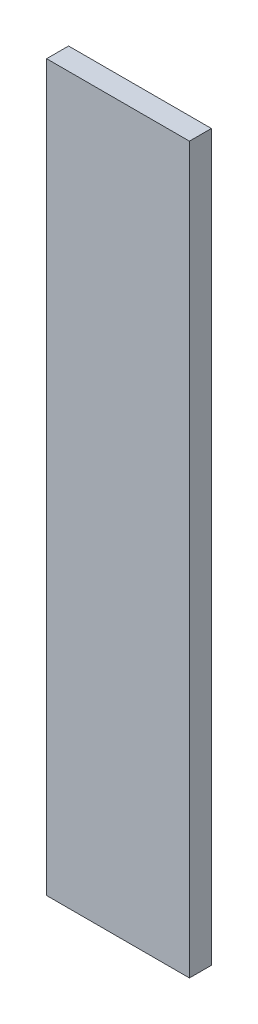
ISO-10303-21;
HEADER;
FILE_DESCRIPTION(('STEP AP214'),'2;1');
FILE_NAME('part.step','',(''),(''),'','','');
FILE_SCHEMA(('AUTOMOTIVE_DESIGN { 1 0 10303 214 1 1 1 1 }'));
ENDSEC;
DATA;
#1=APPLICATION_CONTEXT('core data for automotive mechanical design processes');
#2=APPLICATION_PROTOCOL_DEFINITION('international standard','automotive_design',2000,#1);
#3=PRODUCT_CONTEXT('',#1,'mechanical');
#4=PRODUCT('Part','Part','',(#3));
#5=PRODUCT_RELATED_PRODUCT_CATEGORY('part','',(#4));
#6=PRODUCT_DEFINITION_FORMATION('','',#4);
#7=PRODUCT_DEFINITION_CONTEXT('part definition',#1,'design');
#8=PRODUCT_DEFINITION('design','',#6,#7);
#9=PRODUCT_DEFINITION_SHAPE('','',#8);
#10=(LENGTH_UNIT() NAMED_UNIT(*) SI_UNIT(.MILLI.,.METRE.));
#11=(NAMED_UNIT(*) PLANE_ANGLE_UNIT() SI_UNIT($,.RADIAN.));
#12=(NAMED_UNIT(*) SI_UNIT($,.STERADIAN.) SOLID_ANGLE_UNIT());
#13=UNCERTAINTY_MEASURE_WITH_UNIT(LENGTH_MEASURE(1.E-05),#10,'distance_accuracy_value','');
#14=(GEOMETRIC_REPRESENTATION_CONTEXT(3) GLOBAL_UNCERTAINTY_ASSIGNED_CONTEXT((#13)) GLOBAL_UNIT_ASSIGNED_CONTEXT((#10,
#11,#12)) REPRESENTATION_CONTEXT('',''));
#15=CARTESIAN_POINT('',(0.,0.,0.));
#16=DIRECTION('',(0.,0.,1.));
#17=DIRECTION('',(1.,0.,0.));
#18=AXIS2_PLACEMENT_3D('',#15,#16,#17);
#19=CARTESIAN_POINT('',(-5.85,29.685,1.8));
#20=DIRECTION('',(1.,0.,0.));
#21=DIRECTION('',(0.,1.,0.));
#22=AXIS2_PLACEMENT_3D('',#19,#20,#21);
#23=PLANE('',#22);
#24=DIRECTION('',(0.,-1.,0.));
#25=VECTOR('',#24,1.);
#26=CARTESIAN_POINT('',(-5.85,29.685,0.));
#27=LINE('',#26,#25);
#28=CARTESIAN_POINT('',(-5.85,29.685,0.));
#29=VERTEX_POINT('',#28);
#30=CARTESIAN_POINT('',(-5.85,-29.685,0.));
#31=VERTEX_POINT('',#30);
#32=EDGE_CURVE('E101',#29,#31,#27,.T.);
#33=ORIENTED_EDGE('',*,*,#32,.T.);
#34=DIRECTION('',(0.,0.,-1.));
#35=VECTOR('',#34,1.);
#36=CARTESIAN_POINT('',(-5.85,-29.685,1.8));
#37=LINE('',#36,#35);
#38=CARTESIAN_POINT('',(-5.85,-29.685,1.8));
#39=VERTEX_POINT('',#38);
#40=EDGE_CURVE('E11',#39,#31,#37,.T.);
#41=ORIENTED_EDGE('',*,*,#40,.F.);
#42=DIRECTION('',(0.,-1.,0.));
#43=VECTOR('',#42,1.);
#44=CARTESIAN_POINT('',(-5.85,29.685,1.8));
#45=LINE('',#44,#43);
#46=CARTESIAN_POINT('',(-5.85,29.685,1.8));
#47=VERTEX_POINT('',#46);
#48=EDGE_CURVE('E89',#47,#39,#45,.T.);
#49=ORIENTED_EDGE('',*,*,#48,.F.);
#50=DIRECTION('',(0.,0.,-1.));
#51=VECTOR('',#50,1.);
#52=CARTESIAN_POINT('',(-5.85,29.685,1.8));
#53=LINE('',#52,#51);
#54=EDGE_CURVE('E97',#47,#29,#53,.T.);
#55=ORIENTED_EDGE('',*,*,#54,.T.);
#56=EDGE_LOOP('',(#33,#41,#49,#55));
#57=FACE_BOUND('',#56,.T.);
#58=ADVANCED_FACE('F38',(#57),#23,.F.);
#59=CARTESIAN_POINT('',(5.85,-29.685,1.8));
#60=DIRECTION('',(0.,1.,0.));
#61=DIRECTION('',(0.,0.,1.));
#62=AXIS2_PLACEMENT_3D('',#59,#60,#61);
#63=PLANE('',#62);
#64=DIRECTION('',(1.,0.,0.));
#65=VECTOR('',#64,1.);
#66=CARTESIAN_POINT('',(5.85,-29.685,0.));
#67=LINE('',#66,#65);
#68=CARTESIAN_POINT('',(5.85,-29.685,0.));
#69=VERTEX_POINT('',#68);
#70=EDGE_CURVE('E93',#31,#69,#67,.T.);
#71=ORIENTED_EDGE('',*,*,#70,.T.);
#72=DIRECTION('',(0.,0.,-1.));
#73=VECTOR('',#72,1.);
#74=CARTESIAN_POINT('',(5.85,-29.685,1.8));
#75=LINE('',#74,#73);
#76=CARTESIAN_POINT('',(5.85,-29.685,1.8));
#77=VERTEX_POINT('',#76);
#78=EDGE_CURVE('E46',#77,#69,#75,.T.);
#79=ORIENTED_EDGE('',*,*,#78,.F.);
#80=DIRECTION('',(1.,0.,0.));
#81=VECTOR('',#80,1.);
#82=CARTESIAN_POINT('',(5.85,-29.685,1.8));
#83=LINE('',#82,#81);
#84=EDGE_CURVE('E84',#39,#77,#83,.T.);
#85=ORIENTED_EDGE('',*,*,#84,.F.);
#86=ORIENTED_EDGE('',*,*,#40,.T.);
#87=EDGE_LOOP('',(#71,#79,#85,#86));
#88=FACE_BOUND('',#87,.T.);
#89=ADVANCED_FACE('F92',(#88),#63,.F.);
#90=CARTESIAN_POINT('',(5.85,29.685,1.8));
#91=DIRECTION('',(-1.,0.,0.));
#92=DIRECTION('',(0.,-1.,0.));
#93=AXIS2_PLACEMENT_3D('',#90,#91,#92);
#94=PLANE('',#93);
#95=DIRECTION('',(0.,1.,0.));
#96=VECTOR('',#95,1.);
#97=CARTESIAN_POINT('',(5.85,29.685,0.));
#98=LINE('',#97,#96);
#99=CARTESIAN_POINT('',(5.85,29.685,0.));
#100=VERTEX_POINT('',#99);
#101=EDGE_CURVE('E71',#69,#100,#98,.T.);
#102=ORIENTED_EDGE('',*,*,#101,.T.);
#103=DIRECTION('',(0.,0.,-1.));
#104=VECTOR('',#103,1.);
#105=CARTESIAN_POINT('',(5.85,29.685,1.8));
#106=LINE('',#105,#104);
#107=CARTESIAN_POINT('',(5.85,29.685,1.8));
#108=VERTEX_POINT('',#107);
#109=EDGE_CURVE('E94',#108,#100,#106,.T.);
#110=ORIENTED_EDGE('',*,*,#109,.F.);
#111=DIRECTION('',(0.,1.,0.));
#112=VECTOR('',#111,1.);
#113=CARTESIAN_POINT('',(5.85,29.685,1.8));
#114=LINE('',#113,#112);
#115=EDGE_CURVE('E87',#77,#108,#114,.T.);
#116=ORIENTED_EDGE('',*,*,#115,.F.);
#117=ORIENTED_EDGE('',*,*,#78,.T.);
#118=EDGE_LOOP('',(#102,#110,#116,#117));
#119=FACE_BOUND('',#118,.T.);
#120=ADVANCED_FACE('F95',(#119),#94,.F.);
#121=CARTESIAN_POINT('',(5.85,29.685,1.8));
#122=DIRECTION('',(0.,-1.,0.));
#123=DIRECTION('',(0.,0.,-1.));
#124=AXIS2_PLACEMENT_3D('',#121,#122,#123);
#125=PLANE('',#124);
#126=DIRECTION('',(-1.,0.,0.));
#127=VECTOR('',#126,1.);
#128=CARTESIAN_POINT('',(5.85,29.685,0.));
#129=LINE('',#128,#127);
#130=EDGE_CURVE('E77',#100,#29,#129,.T.);
#131=ORIENTED_EDGE('',*,*,#130,.T.);
#132=ORIENTED_EDGE('',*,*,#54,.F.);
#133=DIRECTION('',(-1.,0.,0.));
#134=VECTOR('',#133,1.);
#135=CARTESIAN_POINT('',(5.85,29.685,1.8));
#136=LINE('',#135,#134);
#137=EDGE_CURVE('E54',#108,#47,#136,.T.);
#138=ORIENTED_EDGE('',*,*,#137,.F.);
#139=ORIENTED_EDGE('',*,*,#109,.T.);
#140=EDGE_LOOP('',(#131,#132,#138,#139));
#141=FACE_BOUND('',#140,.T.);
#142=ADVANCED_FACE('F108',(#141),#125,.F.);
#143=CARTESIAN_POINT('',(0.,0.,1.8));
#144=DIRECTION('',(0.,0.,-1.));
#145=DIRECTION('',(-1.,0.,0.));
#146=AXIS2_PLACEMENT_3D('',#143,#144,#145);
#147=PLANE('',#146);
#148=ORIENTED_EDGE('',*,*,#48,.T.);
#149=ORIENTED_EDGE('',*,*,#84,.T.);
#150=ORIENTED_EDGE('',*,*,#115,.T.);
#151=ORIENTED_EDGE('',*,*,#137,.T.);
#152=EDGE_LOOP('',(#148,#149,#150,#151));
#153=FACE_BOUND('',#152,.T.);
#154=ADVANCED_FACE('F85',(#153),#147,.F.);
#155=CARTESIAN_POINT('',(0.,0.,0.));
#156=DIRECTION('',(0.,0.,-1.));
#157=DIRECTION('',(-1.,0.,0.));
#158=AXIS2_PLACEMENT_3D('',#155,#156,#157);
#159=PLANE('',#158);
#160=ORIENTED_EDGE('',*,*,#32,.F.);
#161=ORIENTED_EDGE('',*,*,#130,.F.);
#162=ORIENTED_EDGE('',*,*,#101,.F.);
#163=ORIENTED_EDGE('',*,*,#70,.F.);
#164=EDGE_LOOP('',(#160,#161,#162,#163));
#165=FACE_BOUND('',#164,.T.);
#166=ADVANCED_FACE('F111',(#165),#159,.T.);
#167=CLOSED_SHELL('',(#58,#89,#120,#142,#154,#166));
#168=MANIFOLD_SOLID_BREP('B2',#167);
#169=ADVANCED_BREP_SHAPE_REPRESENTATION('',(#18,#168),#14);
#170=SHAPE_DEFINITION_REPRESENTATION(#9,#169);
ENDSEC;
END-ISO-10303-21;
